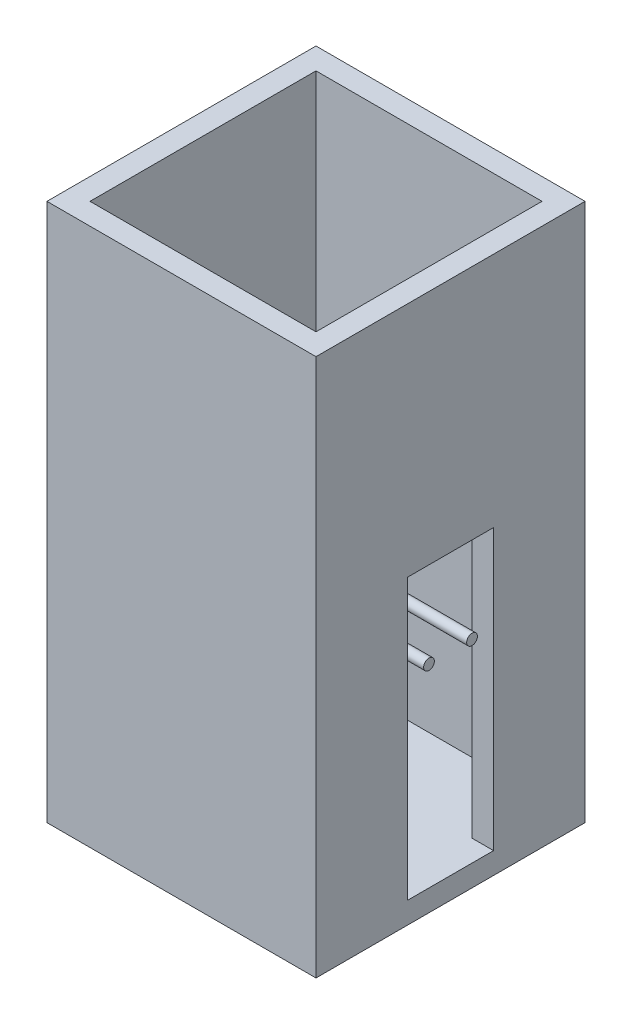
ISO-10303-21;
HEADER;
FILE_DESCRIPTION(('STEP AP214'),'2;1');
FILE_NAME('part.step','',(''),(''),'','','');
FILE_SCHEMA(('AUTOMOTIVE_DESIGN { 1 0 10303 214 1 1 1 1 }'));
ENDSEC;
DATA;
#1=APPLICATION_CONTEXT('core data for automotive mechanical design processes');
#2=APPLICATION_PROTOCOL_DEFINITION('international standard','automotive_design',2000,#1);
#3=PRODUCT_CONTEXT('',#1,'mechanical');
#4=PRODUCT('Part','Part','',(#3));
#5=PRODUCT_RELATED_PRODUCT_CATEGORY('part','',(#4));
#6=PRODUCT_DEFINITION_FORMATION('','',#4);
#7=PRODUCT_DEFINITION_CONTEXT('part definition',#1,'design');
#8=PRODUCT_DEFINITION('design','',#6,#7);
#9=PRODUCT_DEFINITION_SHAPE('','',#8);
#10=(LENGTH_UNIT() NAMED_UNIT(*) SI_UNIT(.MILLI.,.METRE.));
#11=(NAMED_UNIT(*) PLANE_ANGLE_UNIT() SI_UNIT($,.RADIAN.));
#12=(NAMED_UNIT(*) SI_UNIT($,.STERADIAN.) SOLID_ANGLE_UNIT());
#13=UNCERTAINTY_MEASURE_WITH_UNIT(LENGTH_MEASURE(1.E-05),#10,'distance_accuracy_value','');
#14=(GEOMETRIC_REPRESENTATION_CONTEXT(3) GLOBAL_UNCERTAINTY_ASSIGNED_CONTEXT((#13)) GLOBAL_UNIT_ASSIGNED_CONTEXT((#10,
#11,#12)) REPRESENTATION_CONTEXT('',''));
#15=CARTESIAN_POINT('',(0.,0.,0.));
#16=DIRECTION('',(0.,0.,1.));
#17=DIRECTION('',(1.,0.,0.));
#18=AXIS2_PLACEMENT_3D('',#15,#16,#17);
#19=CARTESIAN_POINT('',(39.6875,6.35,39.6875));
#20=DIRECTION('',(-1.,0.,0.));
#21=DIRECTION('',(0.,0.,1.));
#22=AXIS2_PLACEMENT_3D('',#19,#20,#21);
#23=PLANE('',#22);
#24=DIRECTION('',(0.,1.,0.));
#25=VECTOR('',#24,1.);
#26=CARTESIAN_POINT('',(39.6875,6.35,-12.7));
#27=LINE('',#26,#25);
#28=CARTESIAN_POINT('',(39.6875,6.35,-12.7));
#29=VERTEX_POINT('',#28);
#30=CARTESIAN_POINT('',(39.6875,88.9,-12.7));
#31=VERTEX_POINT('',#30);
#32=EDGE_CURVE('E130',#29,#31,#27,.T.);
#33=ORIENTED_EDGE('',*,*,#32,.F.);
#34=DIRECTION('',(0.,0.,-1.));
#35=VECTOR('',#34,1.);
#36=CARTESIAN_POINT('',(39.6875,6.35,-12.7));
#37=LINE('',#36,#35);
#38=CARTESIAN_POINT('',(39.6875,6.35,12.7));
#39=VERTEX_POINT('',#38);
#40=EDGE_CURVE('E134',#39,#29,#37,.T.);
#41=ORIENTED_EDGE('',*,*,#40,.F.);
#42=DIRECTION('',(0.,-1.,0.));
#43=VECTOR('',#42,1.);
#44=CARTESIAN_POINT('',(39.6875,6.35,12.7));
#45=LINE('',#44,#43);
#46=CARTESIAN_POINT('',(39.6875,88.9,12.7));
#47=VERTEX_POINT('',#46);
#48=EDGE_CURVE('E139',#47,#39,#45,.T.);
#49=ORIENTED_EDGE('',*,*,#48,.F.);
#50=DIRECTION('',(0.,0.,1.));
#51=VECTOR('',#50,1.);
#52=CARTESIAN_POINT('',(39.6875,88.9,-12.7));
#53=LINE('',#52,#51);
#54=EDGE_CURVE('E47',#31,#47,#53,.T.);
#55=ORIENTED_EDGE('',*,*,#54,.F.);
#56=EDGE_LOOP('',(#33,#41,#49,#55));
#57=FACE_BOUND('',#56,.T.);
#58=DIRECTION('',(0.,0.,-1.));
#59=VECTOR('',#58,1.);
#60=CARTESIAN_POINT('',(39.6875,0.,39.6875));
#61=LINE('',#60,#59);
#62=CARTESIAN_POINT('',(39.6875,0.,39.6875));
#63=VERTEX_POINT('',#62);
#64=CARTESIAN_POINT('',(39.6875,0.,-39.6875));
#65=VERTEX_POINT('',#64);
#66=EDGE_CURVE('E201',#63,#65,#61,.T.);
#67=ORIENTED_EDGE('',*,*,#66,.T.);
#68=DIRECTION('',(0.,-1.,0.));
#69=VECTOR('',#68,1.);
#70=CARTESIAN_POINT('',(39.6875,6.35,-39.6875));
#71=LINE('',#70,#69);
#72=CARTESIAN_POINT('',(39.6875,158.75,-39.6875));
#73=VERTEX_POINT('',#72);
#74=EDGE_CURVE('E11',#73,#65,#71,.T.);
#75=ORIENTED_EDGE('',*,*,#74,.F.);
#76=DIRECTION('',(0.,0.,-1.));
#77=VECTOR('',#76,1.);
#78=CARTESIAN_POINT('',(39.6875,158.75,39.6875));
#79=LINE('',#78,#77);
#80=CARTESIAN_POINT('',(39.6875,158.75,39.6875));
#81=VERTEX_POINT('',#80);
#82=EDGE_CURVE('E189',#81,#73,#79,.T.);
#83=ORIENTED_EDGE('',*,*,#82,.F.);
#84=DIRECTION('',(0.,-1.,0.));
#85=VECTOR('',#84,1.);
#86=CARTESIAN_POINT('',(39.6875,6.35,39.6875));
#87=LINE('',#86,#85);
#88=EDGE_CURVE('E210',#81,#63,#87,.T.);
#89=ORIENTED_EDGE('',*,*,#88,.T.);
#90=EDGE_LOOP('',(#67,#75,#83,#89));
#91=FACE_BOUND('',#90,.T.);
#92=ADVANCED_FACE('F33',(#57,#91),#23,.F.);
#93=CARTESIAN_POINT('',(-39.6875,6.35,-39.6875));
#94=DIRECTION('',(0.,0.,1.));
#95=DIRECTION('',(1.,0.,0.));
#96=AXIS2_PLACEMENT_3D('',#93,#94,#95);
#97=PLANE('',#96);
#98=DIRECTION('',(-1.,0.,0.));
#99=VECTOR('',#98,1.);
#100=CARTESIAN_POINT('',(-39.6875,0.,-39.6875));
#101=LINE('',#100,#99);
#102=CARTESIAN_POINT('',(-39.6875,0.,-39.6875));
#103=VERTEX_POINT('',#102);
#104=EDGE_CURVE('E204',#65,#103,#101,.T.);
#105=ORIENTED_EDGE('',*,*,#104,.T.);
#106=DIRECTION('',(0.,-1.,0.));
#107=VECTOR('',#106,1.);
#108=CARTESIAN_POINT('',(-39.6875,6.35,-39.6875));
#109=LINE('',#108,#107);
#110=CARTESIAN_POINT('',(-39.6875,158.75,-39.6875));
#111=VERTEX_POINT('',#110);
#112=EDGE_CURVE('E40',#111,#103,#109,.T.);
#113=ORIENTED_EDGE('',*,*,#112,.F.);
#114=DIRECTION('',(-1.,0.,0.));
#115=VECTOR('',#114,1.);
#116=CARTESIAN_POINT('',(-39.6875,158.75,-39.6875));
#117=LINE('',#116,#115);
#118=EDGE_CURVE('E192',#73,#111,#117,.T.);
#119=ORIENTED_EDGE('',*,*,#118,.F.);
#120=ORIENTED_EDGE('',*,*,#74,.T.);
#121=EDGE_LOOP('',(#105,#113,#119,#120));
#122=FACE_BOUND('',#121,.T.);
#123=ADVANCED_FACE('F233',(#122),#97,.F.);
#124=CARTESIAN_POINT('',(-39.6875,6.35,39.6875));
#125=DIRECTION('',(1.,0.,0.));
#126=DIRECTION('',(0.,0.,-1.));
#127=AXIS2_PLACEMENT_3D('',#124,#125,#126);
#128=PLANE('',#127);
#129=DIRECTION('',(0.,0.,1.));
#130=VECTOR('',#129,1.);
#131=CARTESIAN_POINT('',(-39.6875,0.,39.6875));
#132=LINE('',#131,#130);
#133=CARTESIAN_POINT('',(-39.6875,0.,39.6875));
#134=VERTEX_POINT('',#133);
#135=EDGE_CURVE('E206',#103,#134,#132,.T.);
#136=ORIENTED_EDGE('',*,*,#135,.T.);
#137=DIRECTION('',(0.,-1.,0.));
#138=VECTOR('',#137,1.);
#139=CARTESIAN_POINT('',(-39.6875,6.35,39.6875));
#140=LINE('',#139,#138);
#141=CARTESIAN_POINT('',(-39.6875,158.75,39.6875));
#142=VERTEX_POINT('',#141);
#143=EDGE_CURVE('E213',#142,#134,#140,.T.);
#144=ORIENTED_EDGE('',*,*,#143,.F.);
#145=DIRECTION('',(0.,0.,1.));
#146=VECTOR('',#145,1.);
#147=CARTESIAN_POINT('',(-39.6875,158.75,39.6875));
#148=LINE('',#147,#146);
#149=EDGE_CURVE('E195',#111,#142,#148,.T.);
#150=ORIENTED_EDGE('',*,*,#149,.F.);
#151=ORIENTED_EDGE('',*,*,#112,.T.);
#152=EDGE_LOOP('',(#136,#144,#150,#151));
#153=FACE_BOUND('',#152,.T.);
#154=ADVANCED_FACE('F219',(#153),#128,.F.);
#155=CARTESIAN_POINT('',(-39.6875,6.35,39.6875));
#156=DIRECTION('',(0.,0.,-1.));
#157=DIRECTION('',(-1.,0.,0.));
#158=AXIS2_PLACEMENT_3D('',#155,#156,#157);
#159=PLANE('',#158);
#160=DIRECTION('',(1.,0.,0.));
#161=VECTOR('',#160,1.);
#162=CARTESIAN_POINT('',(-39.6875,0.,39.6875));
#163=LINE('',#162,#161);
#164=EDGE_CURVE('E208',#134,#63,#163,.T.);
#165=ORIENTED_EDGE('',*,*,#164,.T.);
#166=ORIENTED_EDGE('',*,*,#88,.F.);
#167=DIRECTION('',(1.,0.,0.));
#168=VECTOR('',#167,1.);
#169=CARTESIAN_POINT('',(-39.6875,158.75,39.6875));
#170=LINE('',#169,#168);
#171=EDGE_CURVE('E198',#142,#81,#170,.T.);
#172=ORIENTED_EDGE('',*,*,#171,.F.);
#173=ORIENTED_EDGE('',*,*,#143,.T.);
#174=EDGE_LOOP('',(#165,#166,#172,#173));
#175=FACE_BOUND('',#174,.T.);
#176=ADVANCED_FACE('F227',(#175),#159,.F.);
#177=CARTESIAN_POINT('',(0.,0.,0.));
#178=DIRECTION('',(0.,-1.,0.));
#179=DIRECTION('',(0.,0.,-1.));
#180=AXIS2_PLACEMENT_3D('',#177,#178,#179);
#181=PLANE('',#180);
#182=ORIENTED_EDGE('',*,*,#66,.F.);
#183=ORIENTED_EDGE('',*,*,#164,.F.);
#184=ORIENTED_EDGE('',*,*,#135,.F.);
#185=ORIENTED_EDGE('',*,*,#104,.F.);
#186=EDGE_LOOP('',(#182,#183,#184,#185));
#187=FACE_BOUND('',#186,.T.);
#188=ADVANCED_FACE('F225',(#187),#181,.T.);
#189=CARTESIAN_POINT('',(0.,158.75,0.));
#190=DIRECTION('',(0.,-1.,0.));
#191=DIRECTION('',(0.,0.,-1.));
#192=AXIS2_PLACEMENT_3D('',#189,#190,#191);
#193=PLANE('',#192);
#194=ORIENTED_EDGE('',*,*,#82,.T.);
#195=ORIENTED_EDGE('',*,*,#118,.T.);
#196=ORIENTED_EDGE('',*,*,#149,.T.);
#197=ORIENTED_EDGE('',*,*,#171,.T.);
#198=EDGE_LOOP('',(#194,#195,#196,#197));
#199=FACE_BOUND('',#198,.T.);
#200=DIRECTION('',(1.,0.,0.));
#201=VECTOR('',#200,1.);
#202=CARTESIAN_POINT('',(-33.3375,158.75,33.3375));
#203=LINE('',#202,#201);
#204=CARTESIAN_POINT('',(-33.3375,158.75,33.3375));
#205=VERTEX_POINT('',#204);
#206=CARTESIAN_POINT('',(33.3375,158.75,33.3375));
#207=VERTEX_POINT('',#206);
#208=EDGE_CURVE('E158',#205,#207,#203,.T.);
#209=ORIENTED_EDGE('',*,*,#208,.F.);
#210=DIRECTION('',(0.,0.,1.));
#211=VECTOR('',#210,1.);
#212=CARTESIAN_POINT('',(-33.3375,158.75,33.3375));
#213=LINE('',#212,#211);
#214=CARTESIAN_POINT('',(-33.3375,158.75,-33.3375));
#215=VERTEX_POINT('',#214);
#216=EDGE_CURVE('E166',#215,#205,#213,.T.);
#217=ORIENTED_EDGE('',*,*,#216,.F.);
#218=DIRECTION('',(-1.,0.,0.));
#219=VECTOR('',#218,1.);
#220=CARTESIAN_POINT('',(-33.3375,158.75,-33.3375));
#221=LINE('',#220,#219);
#222=CARTESIAN_POINT('',(33.3375,158.75,-33.3375));
#223=VERTEX_POINT('',#222);
#224=EDGE_CURVE('E163',#223,#215,#221,.T.);
#225=ORIENTED_EDGE('',*,*,#224,.F.);
#226=DIRECTION('',(0.,0.,-1.));
#227=VECTOR('',#226,1.);
#228=CARTESIAN_POINT('',(33.3375,158.75,33.3375));
#229=LINE('',#228,#227);
#230=EDGE_CURVE('E160',#207,#223,#229,.T.);
#231=ORIENTED_EDGE('',*,*,#230,.F.);
#232=EDGE_LOOP('',(#209,#217,#225,#231));
#233=FACE_BOUND('',#232,.T.);
#234=ADVANCED_FACE('F231',(#199,#233),#193,.F.);
#235=CARTESIAN_POINT('',(-33.3375,158.75,33.3375));
#236=DIRECTION('',(0.,0.,-1.));
#237=DIRECTION('',(-1.,0.,0.));
#238=AXIS2_PLACEMENT_3D('',#235,#236,#237);
#239=PLANE('',#238);
#240=DIRECTION('',(1.,0.,0.));
#241=VECTOR('',#240,1.);
#242=CARTESIAN_POINT('',(-33.3375,6.35,33.3375));
#243=LINE('',#242,#241);
#244=CARTESIAN_POINT('',(-33.3375,6.35,33.3375));
#245=VERTEX_POINT('',#244);
#246=CARTESIAN_POINT('',(33.3375,6.35,33.3375));
#247=VERTEX_POINT('',#246);
#248=EDGE_CURVE('E157',#245,#247,#243,.T.);
#249=ORIENTED_EDGE('',*,*,#248,.F.);
#250=DIRECTION('',(0.,-1.,0.));
#251=VECTOR('',#250,1.);
#252=CARTESIAN_POINT('',(-33.3375,158.75,33.3375));
#253=LINE('',#252,#251);
#254=EDGE_CURVE('E168',#205,#245,#253,.T.);
#255=ORIENTED_EDGE('',*,*,#254,.F.);
#256=ORIENTED_EDGE('',*,*,#208,.T.);
#257=DIRECTION('',(0.,-1.,0.));
#258=VECTOR('',#257,1.);
#259=CARTESIAN_POINT('',(33.3375,158.75,33.3375));
#260=LINE('',#259,#258);
#261=EDGE_CURVE('E186',#207,#247,#260,.T.);
#262=ORIENTED_EDGE('',*,*,#261,.T.);
#263=EDGE_LOOP('',(#249,#255,#256,#262));
#264=FACE_BOUND('',#263,.T.);
#265=ADVANCED_FACE('F251',(#264),#239,.T.);
#266=CARTESIAN_POINT('',(33.3375,158.75,33.3375));
#267=DIRECTION('',(-1.,0.,0.));
#268=DIRECTION('',(0.,0.,1.));
#269=AXIS2_PLACEMENT_3D('',#266,#267,#268);
#270=PLANE('',#269);
#271=DIRECTION('',(0.,1.,0.));
#272=VECTOR('',#271,1.);
#273=CARTESIAN_POINT('',(33.3375,6.35,-12.7));
#274=LINE('',#273,#272);
#275=CARTESIAN_POINT('',(33.3375,6.35,-12.7));
#276=VERTEX_POINT('',#275);
#277=CARTESIAN_POINT('',(33.3375,88.9,-12.7));
#278=VERTEX_POINT('',#277);
#279=EDGE_CURVE('E127',#276,#278,#274,.T.);
#280=ORIENTED_EDGE('',*,*,#279,.T.);
#281=DIRECTION('',(0.,0.,1.));
#282=VECTOR('',#281,1.);
#283=CARTESIAN_POINT('',(33.3375,88.9,-12.7));
#284=LINE('',#283,#282);
#285=CARTESIAN_POINT('',(33.3375,88.9,12.7));
#286=VERTEX_POINT('',#285);
#287=EDGE_CURVE('E124',#278,#286,#284,.T.);
#288=ORIENTED_EDGE('',*,*,#287,.T.);
#289=DIRECTION('',(0.,-1.,0.));
#290=VECTOR('',#289,1.);
#291=CARTESIAN_POINT('',(33.3375,6.35,12.7));
#292=LINE('',#291,#290);
#293=CARTESIAN_POINT('',(33.3375,6.35,12.7));
#294=VERTEX_POINT('',#293);
#295=EDGE_CURVE('E148',#286,#294,#292,.T.);
#296=ORIENTED_EDGE('',*,*,#295,.T.);
#297=DIRECTION('',(0.,0.,-1.));
#298=VECTOR('',#297,1.);
#299=CARTESIAN_POINT('',(33.3375,6.35,33.3375));
#300=LINE('',#299,#298);
#301=EDGE_CURVE('E172',#247,#294,#300,.T.);
#302=ORIENTED_EDGE('',*,*,#301,.F.);
#303=ORIENTED_EDGE('',*,*,#261,.F.);
#304=ORIENTED_EDGE('',*,*,#230,.T.);
#305=DIRECTION('',(0.,-1.,0.));
#306=VECTOR('',#305,1.);
#307=CARTESIAN_POINT('',(33.3375,158.75,-33.3375));
#308=LINE('',#307,#306);
#309=CARTESIAN_POINT('',(33.3375,6.35,-33.3375));
#310=VERTEX_POINT('',#309);
#311=EDGE_CURVE('E183',#223,#310,#308,.T.);
#312=ORIENTED_EDGE('',*,*,#311,.T.);
#313=EDGE_CURVE('E171',#276,#310,#300,.T.);
#314=ORIENTED_EDGE('',*,*,#313,.F.);
#315=EDGE_LOOP('',(#280,#288,#296,#302,#303,#304,#312,#314));
#316=FACE_BOUND('',#315,.T.);
#317=ADVANCED_FACE('F254',(#316),#270,.T.);
#318=CARTESIAN_POINT('',(-33.3375,158.75,-33.3375));
#319=DIRECTION('',(0.,0.,1.));
#320=DIRECTION('',(1.,0.,0.));
#321=AXIS2_PLACEMENT_3D('',#318,#319,#320);
#322=PLANE('',#321);
#323=DIRECTION('',(-1.,0.,0.));
#324=VECTOR('',#323,1.);
#325=CARTESIAN_POINT('',(-33.3375,6.35,-33.3375));
#326=LINE('',#325,#324);
#327=CARTESIAN_POINT('',(-33.3375,6.35,-33.3375));
#328=VERTEX_POINT('',#327);
#329=EDGE_CURVE('E175',#310,#328,#326,.T.);
#330=ORIENTED_EDGE('',*,*,#329,.F.);
#331=ORIENTED_EDGE('',*,*,#311,.F.);
#332=ORIENTED_EDGE('',*,*,#224,.T.);
#333=DIRECTION('',(0.,-1.,0.));
#334=VECTOR('',#333,1.);
#335=CARTESIAN_POINT('',(-33.3375,158.75,-33.3375));
#336=LINE('',#335,#334);
#337=EDGE_CURVE('E181',#215,#328,#336,.T.);
#338=ORIENTED_EDGE('',*,*,#337,.T.);
#339=EDGE_LOOP('',(#330,#331,#332,#338));
#340=FACE_BOUND('',#339,.T.);
#341=ADVANCED_FACE('F258',(#340),#322,.T.);
#342=CARTESIAN_POINT('',(-33.3375,158.75,33.3375));
#343=DIRECTION('',(1.,0.,0.));
#344=DIRECTION('',(0.,0.,-1.));
#345=AXIS2_PLACEMENT_3D('',#342,#343,#344);
#346=PLANE('',#345);
#347=CARTESIAN_POINT('',(-33.3375,63.5,-6.35));
#348=DIRECTION('',(1.,0.,0.));
#349=DIRECTION('',(0.,0.,1.));
#350=AXIS2_PLACEMENT_3D('',#347,#348,#349);
#351=CIRCLE('',#350,1.5875);
#352=CARTESIAN_POINT('',(-33.3375,63.5,-4.7625));
#353=VERTEX_POINT('',#352);
#354=EDGE_CURVE('E295',#353,#353,#351,.T.);
#355=ORIENTED_EDGE('',*,*,#354,.F.);
#356=EDGE_LOOP('',(#355));
#357=FACE_BOUND('',#356,.T.);
#358=CARTESIAN_POINT('',(-33.3375,63.5,6.35));
#359=DIRECTION('',(1.,0.,0.));
#360=DIRECTION('',(0.,0.,-1.));
#361=AXIS2_PLACEMENT_3D('',#358,#359,#360);
#362=CIRCLE('',#361,1.5875);
#363=CARTESIAN_POINT('',(-33.3375,63.5,4.7625));
#364=VERTEX_POINT('',#363);
#365=EDGE_CURVE('E294',#364,#364,#362,.T.);
#366=ORIENTED_EDGE('',*,*,#365,.F.);
#367=EDGE_LOOP('',(#366));
#368=FACE_BOUND('',#367,.T.);
#369=DIRECTION('',(0.,0.,1.));
#370=VECTOR('',#369,1.);
#371=CARTESIAN_POINT('',(-33.3375,6.35,33.3375));
#372=LINE('',#371,#370);
#373=EDGE_CURVE('E161',#328,#245,#372,.T.);
#374=ORIENTED_EDGE('',*,*,#373,.F.);
#375=ORIENTED_EDGE('',*,*,#337,.F.);
#376=ORIENTED_EDGE('',*,*,#216,.T.);
#377=ORIENTED_EDGE('',*,*,#254,.T.);
#378=EDGE_LOOP('',(#374,#375,#376,#377));
#379=FACE_BOUND('',#378,.T.);
#380=ADVANCED_FACE('F248',(#357,#368,#379),#346,.T.);
#381=CARTESIAN_POINT('',(0.,6.35,0.));
#382=DIRECTION('',(0.,-1.,0.));
#383=DIRECTION('',(0.,0.,-1.));
#384=AXIS2_PLACEMENT_3D('',#381,#382,#383);
#385=PLANE('',#384);
#386=ORIENTED_EDGE('',*,*,#373,.T.);
#387=ORIENTED_EDGE('',*,*,#248,.T.);
#388=ORIENTED_EDGE('',*,*,#301,.T.);
#389=DIRECTION('',(1.,0.,0.));
#390=VECTOR('',#389,1.);
#391=CARTESIAN_POINT('',(-53.0318377304701,6.35,12.7));
#392=LINE('',#391,#390);
#393=EDGE_CURVE('E151',#294,#39,#392,.T.);
#394=ORIENTED_EDGE('',*,*,#393,.T.);
#395=ORIENTED_EDGE('',*,*,#40,.T.);
#396=DIRECTION('',(1.,0.,0.));
#397=VECTOR('',#396,1.);
#398=CARTESIAN_POINT('',(-53.0318377304701,6.35,-12.7));
#399=LINE('',#398,#397);
#400=EDGE_CURVE('E55',#276,#29,#399,.T.);
#401=ORIENTED_EDGE('',*,*,#400,.F.);
#402=ORIENTED_EDGE('',*,*,#313,.T.);
#403=ORIENTED_EDGE('',*,*,#329,.T.);
#404=EDGE_LOOP('',(#386,#387,#388,#394,#395,#401,#402,#403));
#405=FACE_BOUND('',#404,.T.);
#406=ADVANCED_FACE('F245',(#405),#385,.F.);
#407=CARTESIAN_POINT('',(-53.0318377304701,6.35,-12.7));
#408=DIRECTION('',(0.,0.,-1.));
#409=DIRECTION('',(-1.,0.,0.));
#410=AXIS2_PLACEMENT_3D('',#407,#408,#409);
#411=PLANE('',#410);
#412=ORIENTED_EDGE('',*,*,#400,.T.);
#413=ORIENTED_EDGE('',*,*,#32,.T.);
#414=DIRECTION('',(1.,0.,0.));
#415=VECTOR('',#414,1.);
#416=CARTESIAN_POINT('',(-53.0318377304701,88.9,-12.7));
#417=LINE('',#416,#415);
#418=EDGE_CURVE('E120',#278,#31,#417,.T.);
#419=ORIENTED_EDGE('',*,*,#418,.F.);
#420=ORIENTED_EDGE('',*,*,#279,.F.);
#421=EDGE_LOOP('',(#412,#413,#419,#420));
#422=FACE_BOUND('',#421,.T.);
#423=ADVANCED_FACE('F131',(#422),#411,.F.);
#424=CARTESIAN_POINT('',(-53.0318377304701,88.9,-12.7));
#425=DIRECTION('',(0.,1.,0.));
#426=DIRECTION('',(0.,0.,1.));
#427=AXIS2_PLACEMENT_3D('',#424,#425,#426);
#428=PLANE('',#427);
#429=ORIENTED_EDGE('',*,*,#418,.T.);
#430=ORIENTED_EDGE('',*,*,#54,.T.);
#431=DIRECTION('',(1.,0.,0.));
#432=VECTOR('',#431,1.);
#433=CARTESIAN_POINT('',(-53.0318377304701,88.9,12.7));
#434=LINE('',#433,#432);
#435=EDGE_CURVE('E152',#286,#47,#434,.T.);
#436=ORIENTED_EDGE('',*,*,#435,.F.);
#437=ORIENTED_EDGE('',*,*,#287,.F.);
#438=EDGE_LOOP('',(#429,#430,#436,#437));
#439=FACE_BOUND('',#438,.T.);
#440=ADVANCED_FACE('F122',(#439),#428,.F.);
#441=CARTESIAN_POINT('',(-53.0318377304701,6.35,12.7));
#442=DIRECTION('',(0.,0.,1.));
#443=DIRECTION('',(1.,0.,0.));
#444=AXIS2_PLACEMENT_3D('',#441,#442,#443);
#445=PLANE('',#444);
#446=ORIENTED_EDGE('',*,*,#435,.T.);
#447=ORIENTED_EDGE('',*,*,#48,.T.);
#448=ORIENTED_EDGE('',*,*,#393,.F.);
#449=ORIENTED_EDGE('',*,*,#295,.F.);
#450=EDGE_LOOP('',(#446,#447,#448,#449));
#451=FACE_BOUND('',#450,.T.);
#452=ADVANCED_FACE('F270',(#451),#445,.F.);
#453=CARTESIAN_POINT('',(44.1776280605346,63.5,6.35));
#454=DIRECTION('',(-1.,0.,0.));
#455=DIRECTION('',(0.,0.,1.));
#456=AXIS2_PLACEMENT_3D('',#453,#454,#455);
#457=CYLINDRICAL_SURFACE('',#456,1.5875);
#458=CARTESIAN_POINT('',(39.6875,63.5,6.35));
#459=DIRECTION('',(-1.,0.,0.));
#460=DIRECTION('',(0.,0.,1.));
#461=AXIS2_PLACEMENT_3D('',#458,#459,#460);
#462=CIRCLE('',#461,1.5875);
#463=CARTESIAN_POINT('',(39.6875,63.5,7.9375));
#464=VERTEX_POINT('',#463);
#465=EDGE_CURVE('E143',#464,#464,#462,.T.);
#466=ORIENTED_EDGE('',*,*,#465,.T.);
#467=EDGE_LOOP('',(#466));
#468=FACE_BOUND('',#467,.T.);
#469=ORIENTED_EDGE('',*,*,#365,.T.);
#470=EDGE_LOOP('',(#469));
#471=FACE_BOUND('',#470,.T.);
#472=ADVANCED_FACE('F273',(#468,#471),#457,.T.);
#473=CARTESIAN_POINT('',(39.6875,6.35,39.6875));
#474=DIRECTION('',(-1.,0.,0.));
#475=DIRECTION('',(0.,0.,1.));
#476=AXIS2_PLACEMENT_3D('',#473,#474,#475);
#477=PLANE('',#476);
#478=ORIENTED_EDGE('',*,*,#465,.F.);
#479=EDGE_LOOP('',(#478));
#480=FACE_BOUND('',#479,.T.);
#481=ADVANCED_FACE('F277',(#480),#477,.F.);
#482=CARTESIAN_POINT('',(44.1776280605346,63.5,-6.35));
#483=DIRECTION('',(-1.,0.,0.));
#484=DIRECTION('',(0.,0.,1.));
#485=AXIS2_PLACEMENT_3D('',#482,#483,#484);
#486=CYLINDRICAL_SURFACE('',#485,1.5875);
#487=CARTESIAN_POINT('',(39.6875,63.5,-6.35));
#488=DIRECTION('',(-1.,0.,0.));
#489=DIRECTION('',(0.,0.,1.));
#490=AXIS2_PLACEMENT_3D('',#487,#488,#489);
#491=CIRCLE('',#490,1.5875);
#492=CARTESIAN_POINT('',(39.6875,63.5,-4.7625));
#493=VERTEX_POINT('',#492);
#494=EDGE_CURVE('E293',#493,#493,#491,.T.);
#495=ORIENTED_EDGE('',*,*,#494,.T.);
#496=EDGE_LOOP('',(#495));
#497=FACE_BOUND('',#496,.T.);
#498=ORIENTED_EDGE('',*,*,#354,.T.);
#499=EDGE_LOOP('',(#498));
#500=FACE_BOUND('',#499,.T.);
#501=ADVANCED_FACE('F281',(#497,#500),#486,.T.);
#502=CARTESIAN_POINT('',(39.6875,6.35,39.6875));
#503=DIRECTION('',(-1.,0.,0.));
#504=DIRECTION('',(0.,0.,1.));
#505=AXIS2_PLACEMENT_3D('',#502,#503,#504);
#506=PLANE('',#505);
#507=ORIENTED_EDGE('',*,*,#494,.F.);
#508=EDGE_LOOP('',(#507));
#509=FACE_BOUND('',#508,.T.);
#510=ADVANCED_FACE('F285',(#509),#506,.F.);
#511=CLOSED_SHELL('',(#92,#123,#154,#176,#188,#234,#265,#317,#341,#380,#406,#423,#440,#452,#472,
#481,#501,#510));
#512=MANIFOLD_SOLID_BREP('B2',#511);
#513=ADVANCED_BREP_SHAPE_REPRESENTATION('',(#18,#512),#14);
#514=SHAPE_DEFINITION_REPRESENTATION(#9,#513);
ENDSEC;
END-ISO-10303-21;
